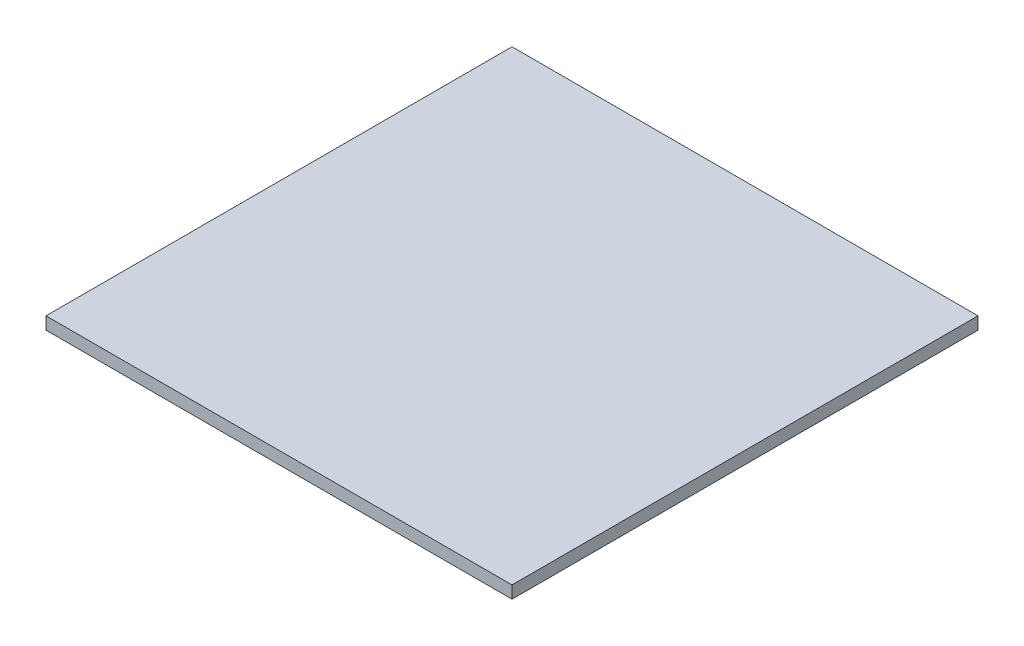
ISO-10303-21;
HEADER;
FILE_DESCRIPTION(('STEP AP214'),'2;1');
FILE_NAME('part.step','',(''),(''),'','','');
FILE_SCHEMA(('AUTOMOTIVE_DESIGN { 1 0 10303 214 1 1 1 1 }'));
ENDSEC;
DATA;
#1=APPLICATION_CONTEXT('core data for automotive mechanical design processes');
#2=APPLICATION_PROTOCOL_DEFINITION('international standard','automotive_design',2000,#1);
#3=PRODUCT_CONTEXT('',#1,'mechanical');
#4=PRODUCT('Part','Part','',(#3));
#5=PRODUCT_RELATED_PRODUCT_CATEGORY('part','',(#4));
#6=PRODUCT_DEFINITION_FORMATION('','',#4);
#7=PRODUCT_DEFINITION_CONTEXT('part definition',#1,'design');
#8=PRODUCT_DEFINITION('design','',#6,#7);
#9=PRODUCT_DEFINITION_SHAPE('','',#8);
#10=(LENGTH_UNIT() NAMED_UNIT(*) SI_UNIT(.MILLI.,.METRE.));
#11=(NAMED_UNIT(*) PLANE_ANGLE_UNIT() SI_UNIT($,.RADIAN.));
#12=(NAMED_UNIT(*) SI_UNIT($,.STERADIAN.) SOLID_ANGLE_UNIT());
#13=UNCERTAINTY_MEASURE_WITH_UNIT(LENGTH_MEASURE(1.E-05),#10,'distance_accuracy_value','');
#14=(GEOMETRIC_REPRESENTATION_CONTEXT(3) GLOBAL_UNCERTAINTY_ASSIGNED_CONTEXT((#13)) GLOBAL_UNIT_ASSIGNED_CONTEXT((#10,
#11,#12)) REPRESENTATION_CONTEXT('',''));
#15=CARTESIAN_POINT('',(0.,0.,0.));
#16=DIRECTION('',(0.,0.,1.));
#17=DIRECTION('',(1.,0.,0.));
#18=AXIS2_PLACEMENT_3D('',#15,#16,#17);
#19=CARTESIAN_POINT('',(150.,8.,150.));
#20=DIRECTION('',(-1.,0.,0.));
#21=DIRECTION('',(0.,0.,1.));
#22=AXIS2_PLACEMENT_3D('',#19,#20,#21);
#23=PLANE('',#22);
#24=DIRECTION('',(0.,0.,-1.));
#25=VECTOR('',#24,1.);
#26=CARTESIAN_POINT('',(150.,0.,150.));
#27=LINE('',#26,#25);
#28=CARTESIAN_POINT('',(150.,0.,150.));
#29=VERTEX_POINT('',#28);
#30=CARTESIAN_POINT('',(150.,0.,-150.));
#31=VERTEX_POINT('',#30);
#32=EDGE_CURVE('E96',#29,#31,#27,.T.);
#33=ORIENTED_EDGE('',*,*,#32,.T.);
#34=DIRECTION('',(0.,-1.,0.));
#35=VECTOR('',#34,1.);
#36=CARTESIAN_POINT('',(150.,8.,-150.));
#37=LINE('',#36,#35);
#38=CARTESIAN_POINT('',(150.,8.,-150.));
#39=VERTEX_POINT('',#38);
#40=EDGE_CURVE('E11',#39,#31,#37,.T.);
#41=ORIENTED_EDGE('',*,*,#40,.F.);
#42=DIRECTION('',(0.,0.,-1.));
#43=VECTOR('',#42,1.);
#44=CARTESIAN_POINT('',(150.,8.,150.));
#45=LINE('',#44,#43);
#46=CARTESIAN_POINT('',(150.,8.,150.));
#47=VERTEX_POINT('',#46);
#48=EDGE_CURVE('E84',#47,#39,#45,.T.);
#49=ORIENTED_EDGE('',*,*,#48,.F.);
#50=DIRECTION('',(0.,-1.,0.));
#51=VECTOR('',#50,1.);
#52=CARTESIAN_POINT('',(150.,8.,150.));
#53=LINE('',#52,#51);
#54=EDGE_CURVE('E92',#47,#29,#53,.T.);
#55=ORIENTED_EDGE('',*,*,#54,.T.);
#56=EDGE_LOOP('',(#33,#41,#49,#55));
#57=FACE_BOUND('',#56,.T.);
#58=ADVANCED_FACE('F33',(#57),#23,.F.);
#59=CARTESIAN_POINT('',(-150.,8.,-150.));
#60=DIRECTION('',(0.,0.,1.));
#61=DIRECTION('',(1.,0.,0.));
#62=AXIS2_PLACEMENT_3D('',#59,#60,#61);
#63=PLANE('',#62);
#64=DIRECTION('',(-1.,0.,0.));
#65=VECTOR('',#64,1.);
#66=CARTESIAN_POINT('',(-150.,0.,-150.));
#67=LINE('',#66,#65);
#68=CARTESIAN_POINT('',(-150.,0.,-150.));
#69=VERTEX_POINT('',#68);
#70=EDGE_CURVE('E88',#31,#69,#67,.T.);
#71=ORIENTED_EDGE('',*,*,#70,.T.);
#72=DIRECTION('',(0.,-1.,0.));
#73=VECTOR('',#72,1.);
#74=CARTESIAN_POINT('',(-150.,8.,-150.));
#75=LINE('',#74,#73);
#76=CARTESIAN_POINT('',(-150.,8.,-150.));
#77=VERTEX_POINT('',#76);
#78=EDGE_CURVE('E41',#77,#69,#75,.T.);
#79=ORIENTED_EDGE('',*,*,#78,.F.);
#80=DIRECTION('',(-1.,0.,0.));
#81=VECTOR('',#80,1.);
#82=CARTESIAN_POINT('',(-150.,8.,-150.));
#83=LINE('',#82,#81);
#84=EDGE_CURVE('E79',#39,#77,#83,.T.);
#85=ORIENTED_EDGE('',*,*,#84,.F.);
#86=ORIENTED_EDGE('',*,*,#40,.T.);
#87=EDGE_LOOP('',(#71,#79,#85,#86));
#88=FACE_BOUND('',#87,.T.);
#89=ADVANCED_FACE('F87',(#88),#63,.F.);
#90=CARTESIAN_POINT('',(-150.,8.,150.));
#91=DIRECTION('',(1.,0.,0.));
#92=DIRECTION('',(0.,0.,-1.));
#93=AXIS2_PLACEMENT_3D('',#90,#91,#92);
#94=PLANE('',#93);
#95=DIRECTION('',(0.,0.,1.));
#96=VECTOR('',#95,1.);
#97=CARTESIAN_POINT('',(-150.,0.,150.));
#98=LINE('',#97,#96);
#99=CARTESIAN_POINT('',(-150.,0.,150.));
#100=VERTEX_POINT('',#99);
#101=EDGE_CURVE('E66',#69,#100,#98,.T.);
#102=ORIENTED_EDGE('',*,*,#101,.T.);
#103=DIRECTION('',(0.,-1.,0.));
#104=VECTOR('',#103,1.);
#105=CARTESIAN_POINT('',(-150.,8.,150.));
#106=LINE('',#105,#104);
#107=CARTESIAN_POINT('',(-150.,8.,150.));
#108=VERTEX_POINT('',#107);
#109=EDGE_CURVE('E89',#108,#100,#106,.T.);
#110=ORIENTED_EDGE('',*,*,#109,.F.);
#111=DIRECTION('',(0.,0.,1.));
#112=VECTOR('',#111,1.);
#113=CARTESIAN_POINT('',(-150.,8.,150.));
#114=LINE('',#113,#112);
#115=EDGE_CURVE('E82',#77,#108,#114,.T.);
#116=ORIENTED_EDGE('',*,*,#115,.F.);
#117=ORIENTED_EDGE('',*,*,#78,.T.);
#118=EDGE_LOOP('',(#102,#110,#116,#117));
#119=FACE_BOUND('',#118,.T.);
#120=ADVANCED_FACE('F90',(#119),#94,.F.);
#121=CARTESIAN_POINT('',(-150.,8.,150.));
#122=DIRECTION('',(0.,0.,-1.));
#123=DIRECTION('',(-1.,0.,0.));
#124=AXIS2_PLACEMENT_3D('',#121,#122,#123);
#125=PLANE('',#124);
#126=DIRECTION('',(1.,0.,0.));
#127=VECTOR('',#126,1.);
#128=CARTESIAN_POINT('',(-150.,0.,150.));
#129=LINE('',#128,#127);
#130=EDGE_CURVE('E72',#100,#29,#129,.T.);
#131=ORIENTED_EDGE('',*,*,#130,.T.);
#132=ORIENTED_EDGE('',*,*,#54,.F.);
#133=DIRECTION('',(1.,0.,0.));
#134=VECTOR('',#133,1.);
#135=CARTESIAN_POINT('',(-150.,8.,150.));
#136=LINE('',#135,#134);
#137=EDGE_CURVE('E49',#108,#47,#136,.T.);
#138=ORIENTED_EDGE('',*,*,#137,.F.);
#139=ORIENTED_EDGE('',*,*,#109,.T.);
#140=EDGE_LOOP('',(#131,#132,#138,#139));
#141=FACE_BOUND('',#140,.T.);
#142=ADVANCED_FACE('F103',(#141),#125,.F.);
#143=CARTESIAN_POINT('',(0.,8.,0.));
#144=DIRECTION('',(0.,-1.,0.));
#145=DIRECTION('',(0.,0.,-1.));
#146=AXIS2_PLACEMENT_3D('',#143,#144,#145);
#147=PLANE('',#146);
#148=ORIENTED_EDGE('',*,*,#48,.T.);
#149=ORIENTED_EDGE('',*,*,#84,.T.);
#150=ORIENTED_EDGE('',*,*,#115,.T.);
#151=ORIENTED_EDGE('',*,*,#137,.T.);
#152=EDGE_LOOP('',(#148,#149,#150,#151));
#153=FACE_BOUND('',#152,.T.);
#154=ADVANCED_FACE('F80',(#153),#147,.F.);
#155=CARTESIAN_POINT('',(0.,0.,0.));
#156=DIRECTION('',(0.,-1.,0.));
#157=DIRECTION('',(0.,0.,-1.));
#158=AXIS2_PLACEMENT_3D('',#155,#156,#157);
#159=PLANE('',#158);
#160=ORIENTED_EDGE('',*,*,#32,.F.);
#161=ORIENTED_EDGE('',*,*,#130,.F.);
#162=ORIENTED_EDGE('',*,*,#101,.F.);
#163=ORIENTED_EDGE('',*,*,#70,.F.);
#164=EDGE_LOOP('',(#160,#161,#162,#163));
#165=FACE_BOUND('',#164,.T.);
#166=ADVANCED_FACE('F106',(#165),#159,.T.);
#167=CLOSED_SHELL('',(#58,#89,#120,#142,#154,#166));
#168=MANIFOLD_SOLID_BREP('B2',#167);
#169=ADVANCED_BREP_SHAPE_REPRESENTATION('',(#18,#168),#14);
#170=SHAPE_DEFINITION_REPRESENTATION(#9,#169);
ENDSEC;
END-ISO-10303-21;
